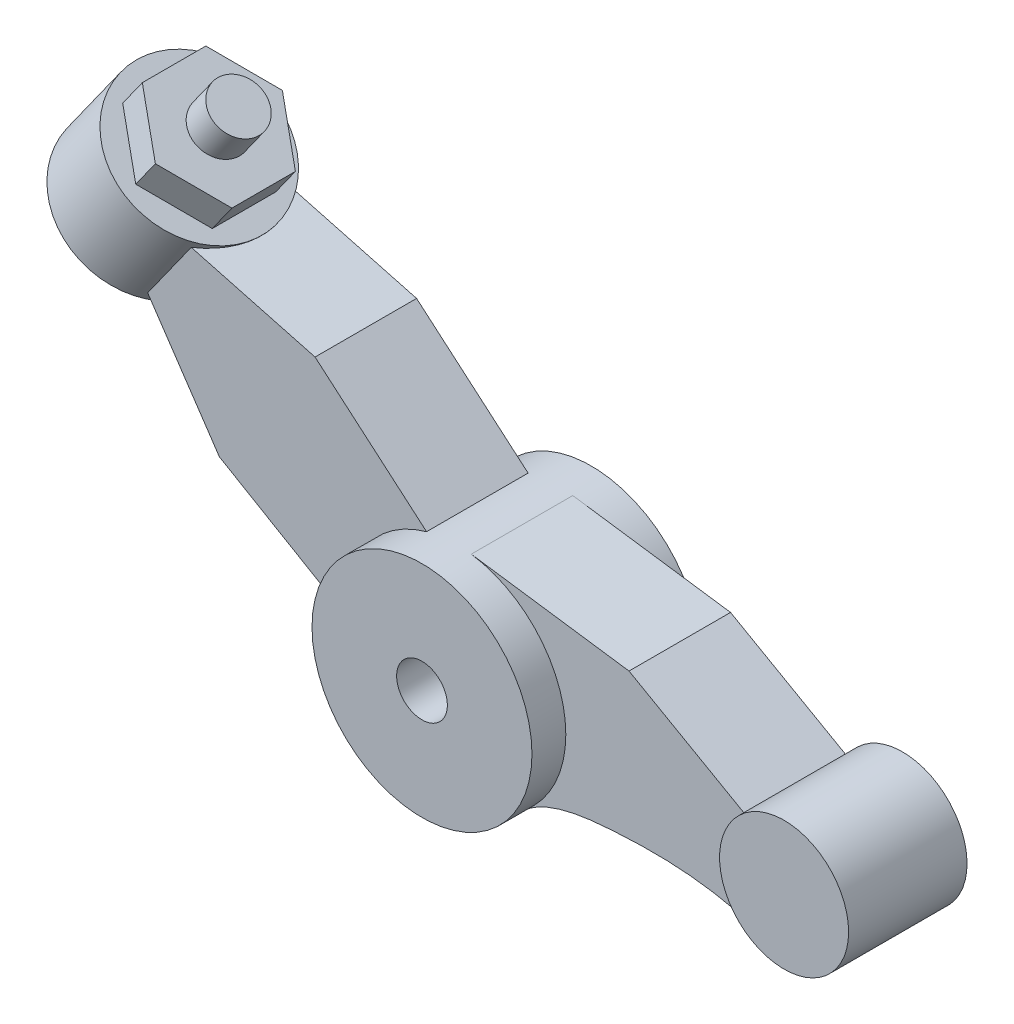
ISO-10303-21;
HEADER;
FILE_DESCRIPTION(('STEP AP214'),'2;1');
FILE_NAME('part.step','',(''),(''),'','','');
FILE_SCHEMA(('AUTOMOTIVE_DESIGN { 1 0 10303 214 1 1 1 1 }'));
ENDSEC;
DATA;
#1=APPLICATION_CONTEXT('core data for automotive mechanical design processes');
#2=APPLICATION_PROTOCOL_DEFINITION('international standard','automotive_design',2000,#1);
#3=PRODUCT_CONTEXT('',#1,'mechanical');
#4=PRODUCT('Part','Part','',(#3));
#5=PRODUCT_RELATED_PRODUCT_CATEGORY('part','',(#4));
#6=PRODUCT_DEFINITION_FORMATION('','',#4);
#7=PRODUCT_DEFINITION_CONTEXT('part definition',#1,'design');
#8=PRODUCT_DEFINITION('design','',#6,#7);
#9=PRODUCT_DEFINITION_SHAPE('','',#8);
#10=(LENGTH_UNIT() NAMED_UNIT(*) SI_UNIT(.MILLI.,.METRE.));
#11=(NAMED_UNIT(*) PLANE_ANGLE_UNIT() SI_UNIT($,.RADIAN.));
#12=(NAMED_UNIT(*) SI_UNIT($,.STERADIAN.) SOLID_ANGLE_UNIT());
#13=UNCERTAINTY_MEASURE_WITH_UNIT(LENGTH_MEASURE(1.E-05),#10,'distance_accuracy_value','');
#14=(GEOMETRIC_REPRESENTATION_CONTEXT(3) GLOBAL_UNCERTAINTY_ASSIGNED_CONTEXT((#13)) GLOBAL_UNIT_ASSIGNED_CONTEXT((#10,
#11,#12)) REPRESENTATION_CONTEXT('',''));
#15=CARTESIAN_POINT('',(0.,0.,0.));
#16=DIRECTION('',(0.,0.,1.));
#17=DIRECTION('',(1.,0.,0.));
#18=AXIS2_PLACEMENT_3D('',#15,#16,#17);
#19=CARTESIAN_POINT('',(0.,0.,25.4));
#20=DIRECTION('',(0.,0.,-1.));
#21=DIRECTION('',(-1.,0.,0.));
#22=AXIS2_PLACEMENT_3D('',#19,#20,#21);
#23=CYLINDRICAL_SURFACE('',#22,7.62);
#24=CARTESIAN_POINT('',(0.,0.,25.4));
#25=DIRECTION('',(0.,0.,1.));
#26=DIRECTION('',(1.,0.,0.));
#27=AXIS2_PLACEMENT_3D('',#24,#25,#26);
#28=CIRCLE('',#27,7.62);
#29=CARTESIAN_POINT('',(7.62,0.,25.4));
#30=VERTEX_POINT('',#29);
#31=EDGE_CURVE('E324',#30,#30,#28,.T.);
#32=ORIENTED_EDGE('',*,*,#31,.T.);
#33=EDGE_LOOP('',(#32));
#34=FACE_BOUND('',#33,.T.);
#35=CARTESIAN_POINT('',(0.,0.,-25.4));
#36=DIRECTION('',(0.,0.,1.));
#37=DIRECTION('',(1.,0.,0.));
#38=AXIS2_PLACEMENT_3D('',#35,#36,#37);
#39=CIRCLE('',#38,7.62);
#40=CARTESIAN_POINT('',(7.62,0.,-25.4));
#41=VERTEX_POINT('',#40);
#42=EDGE_CURVE('E325',#41,#41,#39,.T.);
#43=ORIENTED_EDGE('',*,*,#42,.F.);
#44=EDGE_LOOP('',(#43));
#45=FACE_BOUND('',#44,.T.);
#46=ADVANCED_FACE('F44',(#34,#45),#23,.F.);
#47=CARTESIAN_POINT('',(0.,0.,25.4));
#48=DIRECTION('',(0.,0.,-1.));
#49=DIRECTION('',(-1.,0.,0.));
#50=AXIS2_PLACEMENT_3D('',#47,#48,#49);
#51=CYLINDRICAL_SURFACE('',#50,33.02);
#52=DIRECTION('',(0.,0.,-1.));
#53=VECTOR('',#52,1.);
#54=CARTESIAN_POINT('',(-8.78149822097489,31.8308920546537,15.24));
#55=LINE('',#54,#53);
#56=CARTESIAN_POINT('',(-8.78149822097489,31.8308920546537,15.24));
#57=VERTEX_POINT('',#56);
#58=CARTESIAN_POINT('',(-8.78149822097489,31.8308920546537,-15.24));
#59=VERTEX_POINT('',#58);
#60=EDGE_CURVE('E262',#57,#59,#55,.T.);
#61=ORIENTED_EDGE('',*,*,#60,.F.);
#62=CARTESIAN_POINT('',(0.,0.,15.24));
#63=DIRECTION('',(0.,0.,1.));
#64=DIRECTION('',(1.,0.,0.));
#65=AXIS2_PLACEMENT_3D('',#62,#63,#64);
#66=CIRCLE('',#65,33.02);
#67=CARTESIAN_POINT('',(-32.9535005305209,-2.09456505866027,15.24));
#68=VERTEX_POINT('',#67);
#69=EDGE_CURVE('E217',#57,#68,#66,.T.);
#70=ORIENTED_EDGE('',*,*,#69,.T.);
#71=DIRECTION('',(0.,0.,-1.));
#72=VECTOR('',#71,1.);
#73=CARTESIAN_POINT('',(-32.9535005305209,-2.09456505866026,15.24));
#74=LINE('',#73,#72);
#75=CARTESIAN_POINT('',(-32.9535005305209,-2.09456505866026,-15.24));
#76=VERTEX_POINT('',#75);
#77=EDGE_CURVE('E235',#68,#76,#74,.T.);
#78=ORIENTED_EDGE('',*,*,#77,.T.);
#79=CARTESIAN_POINT('',(0.,0.,-15.24));
#80=DIRECTION('',(0.,0.,1.));
#81=DIRECTION('',(1.,0.,0.));
#82=AXIS2_PLACEMENT_3D('',#79,#80,#81);
#83=CIRCLE('',#82,33.02);
#84=EDGE_CURVE('E216',#59,#76,#83,.T.);
#85=ORIENTED_EDGE('',*,*,#84,.F.);
#86=EDGE_LOOP('',(#61,#70,#78,#85));
#87=FACE_BOUND('',#86,.T.);
#88=DIRECTION('',(0.,0.,-1.));
#89=VECTOR('',#88,1.);
#90=CARTESIAN_POINT('',(20.81989802796,-25.6291288596656,15.24));
#91=LINE('',#90,#89);
#92=CARTESIAN_POINT('',(20.81989802796,-25.6291288596656,15.24));
#93=VERTEX_POINT('',#92);
#94=CARTESIAN_POINT('',(20.81989802796,-25.6291288596656,-15.24));
#95=VERTEX_POINT('',#94);
#96=EDGE_CURVE('E314',#93,#95,#91,.T.);
#97=ORIENTED_EDGE('',*,*,#96,.F.);
#98=CARTESIAN_POINT('',(0.,0.,15.24));
#99=DIRECTION('',(0.,0.,1.));
#100=DIRECTION('',(1.,0.,0.));
#101=AXIS2_PLACEMENT_3D('',#98,#99,#100);
#102=CIRCLE('',#101,33.02);
#103=CARTESIAN_POINT('',(4.62675905087346,32.6942426229017,15.24));
#104=VERTEX_POINT('',#103);
#105=EDGE_CURVE('E358',#93,#104,#102,.T.);
#106=ORIENTED_EDGE('',*,*,#105,.T.);
#107=DIRECTION('',(0.,0.,-1.));
#108=VECTOR('',#107,1.);
#109=CARTESIAN_POINT('',(4.62675905087347,32.6942426229017,15.24));
#110=LINE('',#109,#108);
#111=CARTESIAN_POINT('',(4.62675905087347,32.6942426229017,-15.24));
#112=VERTEX_POINT('',#111);
#113=EDGE_CURVE('E353',#104,#112,#110,.T.);
#114=ORIENTED_EDGE('',*,*,#113,.T.);
#115=CARTESIAN_POINT('',(0.,0.,-15.24));
#116=DIRECTION('',(0.,0.,1.));
#117=DIRECTION('',(1.,0.,0.));
#118=AXIS2_PLACEMENT_3D('',#115,#116,#117);
#119=CIRCLE('',#118,33.02);
#120=EDGE_CURVE('E283',#95,#112,#119,.T.);
#121=ORIENTED_EDGE('',*,*,#120,.F.);
#122=EDGE_LOOP('',(#97,#106,#114,#121));
#123=FACE_BOUND('',#122,.T.);
#124=CARTESIAN_POINT('',(0.,0.,25.4));
#125=DIRECTION('',(0.,0.,1.));
#126=DIRECTION('',(1.,0.,0.));
#127=AXIS2_PLACEMENT_3D('',#124,#125,#126);
#128=CIRCLE('',#127,33.02);
#129=CARTESIAN_POINT('',(33.02,0.,25.4));
#130=VERTEX_POINT('',#129);
#131=EDGE_CURVE('E318',#130,#130,#128,.T.);
#132=ORIENTED_EDGE('',*,*,#131,.F.);
#133=EDGE_LOOP('',(#132));
#134=FACE_BOUND('',#133,.T.);
#135=CARTESIAN_POINT('',(0.,0.,-25.4));
#136=DIRECTION('',(0.,0.,1.));
#137=DIRECTION('',(1.,0.,0.));
#138=AXIS2_PLACEMENT_3D('',#135,#136,#137);
#139=CIRCLE('',#138,33.02);
#140=CARTESIAN_POINT('',(33.02,0.,-25.4));
#141=VERTEX_POINT('',#140);
#142=EDGE_CURVE('E321',#141,#141,#139,.T.);
#143=ORIENTED_EDGE('',*,*,#142,.T.);
#144=EDGE_LOOP('',(#143));
#145=FACE_BOUND('',#144,.T.);
#146=ADVANCED_FACE('F300',(#87,#123,#134,#145),#51,.T.);
#147=CARTESIAN_POINT('',(0.,0.,25.4));
#148=DIRECTION('',(0.,0.,1.));
#149=DIRECTION('',(1.,0.,0.));
#150=AXIS2_PLACEMENT_3D('',#147,#148,#149);
#151=PLANE('',#150);
#152=ORIENTED_EDGE('',*,*,#31,.F.);
#153=EDGE_LOOP('',(#152));
#154=FACE_BOUND('',#153,.T.);
#155=ORIENTED_EDGE('',*,*,#131,.T.);
#156=EDGE_LOOP('',(#155));
#157=FACE_BOUND('',#156,.T.);
#158=ADVANCED_FACE('F297',(#154,#157),#151,.T.);
#159=CARTESIAN_POINT('',(0.,0.,-25.4));
#160=DIRECTION('',(0.,0.,1.));
#161=DIRECTION('',(1.,0.,0.));
#162=AXIS2_PLACEMENT_3D('',#159,#160,#161);
#163=PLANE('',#162);
#164=ORIENTED_EDGE('',*,*,#42,.T.);
#165=EDGE_LOOP('',(#164));
#166=FACE_BOUND('',#165,.T.);
#167=ORIENTED_EDGE('',*,*,#142,.F.);
#168=EDGE_LOOP('',(#167));
#169=FACE_BOUND('',#168,.T.);
#170=ADVANCED_FACE('F294',(#166,#169),#163,.F.);
#171=CARTESIAN_POINT('',(89.3169550965066,-21.7241330754746,15.24));
#172=CARTESIAN_POINT('',(75.2764612033942,-17.4261699313366,15.24));
#173=CARTESIAN_POINT('',(52.8366105993641,-16.6710148810154,15.24));
#174=CARTESIAN_POINT('',(28.0082030744665,-19.7896881638226,15.24));
#175=CARTESIAN_POINT('',(20.81989802796,-25.6291288596656,15.24));
#176=B_SPLINE_CURVE_WITH_KNOTS('',3,(#171,#172,#173,#174,#175),.UNSPECIFIED.,.F.,.F.,(4,1,4),
(0.,0.609501507274578,1.),.UNSPECIFIED.);
#177=DIRECTION('',(0.,0.,-1.));
#178=VECTOR('',#177,1.);
#179=SURFACE_OF_LINEAR_EXTRUSION('',#176,#178);
#180=CARTESIAN_POINT('',(89.3169550965066,-21.7241330754746,-15.24));
#181=CARTESIAN_POINT('',(75.2764612033942,-17.4261699313366,-15.24));
#182=CARTESIAN_POINT('',(52.8366105993641,-16.6710148810154,-15.24));
#183=CARTESIAN_POINT('',(28.0082030744665,-19.7896881638226,-15.24));
#184=CARTESIAN_POINT('',(20.81989802796,-25.6291288596656,-15.24));
#185=B_SPLINE_CURVE_WITH_KNOTS('',3,(#180,#181,#182,#183,#184),.UNSPECIFIED.,.F.,.F.,(4,1,4),
(0.,0.609501507274578,1.),.UNSPECIFIED.);
#186=CARTESIAN_POINT('',(89.3169550965066,-21.7241330754746,-15.24));
#187=VERTEX_POINT('',#186);
#188=EDGE_CURVE('E271',#187,#95,#185,.T.);
#189=ORIENTED_EDGE('',*,*,#188,.F.);
#190=DIRECTION('',(0.,0.,-1.));
#191=VECTOR('',#190,1.);
#192=CARTESIAN_POINT('',(89.3169550965066,-21.7241330754746,15.24));
#193=LINE('',#192,#191);
#194=CARTESIAN_POINT('',(89.3169550965066,-21.7241330754746,15.24));
#195=VERTEX_POINT('',#194);
#196=EDGE_CURVE('E332',#195,#187,#193,.T.);
#197=ORIENTED_EDGE('',*,*,#196,.F.);
#198=EDGE_CURVE('E275',#195,#93,#176,.T.);
#199=ORIENTED_EDGE('',*,*,#198,.T.);
#200=ORIENTED_EDGE('',*,*,#96,.T.);
#201=EDGE_LOOP('',(#189,#197,#199,#200));
#202=FACE_BOUND('',#201,.T.);
#203=ADVANCED_FACE('F289',(#202),#179,.T.);
#204=CARTESIAN_POINT('',(23.8603711232424,41.9814773097678,15.24));
#205=DIRECTION('',(-0.494123043437464,-0.869391981757422,0.));
#206=DIRECTION('',(0.869391981757422,-0.494123043437464,0.));
#207=AXIS2_PLACEMENT_3D('',#204,#205,#206);
#208=PLANE('',#207);
#209=DIRECTION('',(-0.869391981757422,0.494123043437464,0.));
#210=VECTOR('',#209,1.);
#211=CARTESIAN_POINT('',(23.8603711232424,41.9814773097678,-15.24));
#212=LINE('',#211,#210);
#213=CARTESIAN_POINT('',(86.4956046015693,6.38244621430674,-15.24));
#214=VERTEX_POINT('',#213);
#215=CARTESIAN_POINT('',(51.9953519197285,25.9908279480012,-15.24));
#216=VERTEX_POINT('',#215);
#217=EDGE_CURVE('E366',#214,#216,#212,.T.);
#218=ORIENTED_EDGE('',*,*,#217,.T.);
#219=DIRECTION('',(0.,0.,-1.));
#220=VECTOR('',#219,1.);
#221=CARTESIAN_POINT('',(51.9953519197285,25.9908279480012,15.24));
#222=LINE('',#221,#220);
#223=CARTESIAN_POINT('',(51.9953519197285,25.9908279480012,15.24));
#224=VERTEX_POINT('',#223);
#225=EDGE_CURVE('E349',#224,#216,#222,.T.);
#226=ORIENTED_EDGE('',*,*,#225,.F.);
#227=DIRECTION('',(-0.869391981757422,0.494123043437464,0.));
#228=VECTOR('',#227,1.);
#229=CARTESIAN_POINT('',(23.8603711232424,41.9814773097678,15.24));
#230=LINE('',#229,#228);
#231=CARTESIAN_POINT('',(86.4956046015693,6.38244621430674,15.24));
#232=VERTEX_POINT('',#231);
#233=EDGE_CURVE('E386',#232,#224,#230,.T.);
#234=ORIENTED_EDGE('',*,*,#233,.F.);
#235=DIRECTION('',(0.,0.,-1.));
#236=VECTOR('',#235,1.);
#237=CARTESIAN_POINT('',(86.4956046015693,6.38244621430675,15.24));
#238=LINE('',#237,#236);
#239=EDGE_CURVE('E345',#232,#214,#238,.T.);
#240=ORIENTED_EDGE('',*,*,#239,.T.);
#241=EDGE_LOOP('',(#218,#226,#234,#240));
#242=FACE_BOUND('',#241,.T.);
#243=ADVANCED_FACE('F293',(#242),#208,.F.);
#244=CARTESIAN_POINT('',(4.62675905087346,32.6942426229017,15.24));
#245=DIRECTION('',(-0.140119898572788,-0.990134543394963,0.));
#246=DIRECTION('',(0.990134543394963,-0.140119898572788,0.));
#247=AXIS2_PLACEMENT_3D('',#244,#245,#246);
#248=PLANE('',#247);
#249=DIRECTION('',(-0.990134543394963,0.140119898572788,0.));
#250=VECTOR('',#249,1.);
#251=CARTESIAN_POINT('',(4.62675905087346,32.6942426229017,-15.24));
#252=LINE('',#251,#250);
#253=EDGE_CURVE('E362',#216,#112,#252,.T.);
#254=ORIENTED_EDGE('',*,*,#253,.T.);
#255=ORIENTED_EDGE('',*,*,#113,.F.);
#256=DIRECTION('',(-0.990134543394963,0.140119898572788,0.));
#257=VECTOR('',#256,1.);
#258=CARTESIAN_POINT('',(4.62675905087346,32.6942426229017,15.24));
#259=LINE('',#258,#257);
#260=EDGE_CURVE('E383',#224,#104,#259,.T.);
#261=ORIENTED_EDGE('',*,*,#260,.F.);
#262=ORIENTED_EDGE('',*,*,#225,.T.);
#263=EDGE_LOOP('',(#254,#255,#261,#262));
#264=FACE_BOUND('',#263,.T.);
#265=ADVANCED_FACE('F405',(#264),#248,.F.);
#266=CARTESIAN_POINT('',(0.,0.,15.24));
#267=DIRECTION('',(0.,0.,1.));
#268=DIRECTION('',(1.,0.,0.));
#269=AXIS2_PLACEMENT_3D('',#266,#267,#268);
#270=PLANE('',#269);
#271=ORIENTED_EDGE('',*,*,#198,.F.);
#272=CARTESIAN_POINT('',(101.092,-6.34725518135334,15.24));
#273=DIRECTION('',(0.,0.,1.));
#274=DIRECTION('',(1.,0.,0.));
#275=AXIS2_PLACEMENT_3D('',#272,#273,#274);
#276=CIRCLE('',#275,19.3675);
#277=EDGE_CURVE('E282',#232,#195,#276,.T.);
#278=ORIENTED_EDGE('',*,*,#277,.F.);
#279=ORIENTED_EDGE('',*,*,#233,.T.);
#280=ORIENTED_EDGE('',*,*,#260,.T.);
#281=ORIENTED_EDGE('',*,*,#105,.F.);
#282=EDGE_LOOP('',(#271,#278,#279,#280,#281));
#283=FACE_BOUND('',#282,.T.);
#284=ADVANCED_FACE('F400',(#283),#270,.T.);
#285=CARTESIAN_POINT('',(0.,0.,-15.24));
#286=DIRECTION('',(0.,0.,1.));
#287=DIRECTION('',(1.,0.,0.));
#288=AXIS2_PLACEMENT_3D('',#285,#286,#287);
#289=PLANE('',#288);
#290=ORIENTED_EDGE('',*,*,#188,.T.);
#291=ORIENTED_EDGE('',*,*,#120,.T.);
#292=ORIENTED_EDGE('',*,*,#253,.F.);
#293=ORIENTED_EDGE('',*,*,#217,.F.);
#294=CARTESIAN_POINT('',(101.092,-6.34725518135334,-15.24));
#295=DIRECTION('',(0.,0.,1.));
#296=DIRECTION('',(1.,0.,0.));
#297=AXIS2_PLACEMENT_3D('',#294,#295,#296);
#298=CIRCLE('',#297,19.3675);
#299=EDGE_CURVE('E369',#214,#187,#298,.T.);
#300=ORIENTED_EDGE('',*,*,#299,.T.);
#301=EDGE_LOOP('',(#290,#291,#292,#293,#300));
#302=FACE_BOUND('',#301,.T.);
#303=ADVANCED_FACE('F408',(#302),#289,.F.);
#304=CARTESIAN_POINT('',(101.092,-6.34725518135334,17.78));
#305=DIRECTION('',(0.,0.,-1.));
#306=DIRECTION('',(-1.,0.,0.));
#307=AXIS2_PLACEMENT_3D('',#304,#305,#306);
#308=CYLINDRICAL_SURFACE('',#307,19.3675);
#309=ORIENTED_EDGE('',*,*,#277,.T.);
#310=ORIENTED_EDGE('',*,*,#196,.T.);
#311=ORIENTED_EDGE('',*,*,#299,.F.);
#312=ORIENTED_EDGE('',*,*,#239,.F.);
#313=EDGE_LOOP('',(#309,#310,#311,#312));
#314=FACE_BOUND('',#313,.T.);
#315=CARTESIAN_POINT('',(101.092,-6.34725518135334,17.78));
#316=DIRECTION('',(0.,0.,1.));
#317=DIRECTION('',(1.,0.,0.));
#318=AXIS2_PLACEMENT_3D('',#315,#316,#317);
#319=CIRCLE('',#318,19.3675);
#320=CARTESIAN_POINT('',(120.4595,-6.34725518135334,17.78));
#321=VERTEX_POINT('',#320);
#322=EDGE_CURVE('E267',#321,#321,#319,.T.);
#323=ORIENTED_EDGE('',*,*,#322,.F.);
#324=EDGE_LOOP('',(#323));
#325=FACE_BOUND('',#324,.T.);
#326=CARTESIAN_POINT('',(101.092,-6.34725518135334,-17.78));
#327=DIRECTION('',(0.,0.,1.));
#328=DIRECTION('',(1.,0.,0.));
#329=AXIS2_PLACEMENT_3D('',#326,#327,#328);
#330=CIRCLE('',#329,19.3675);
#331=CARTESIAN_POINT('',(120.4595,-6.34725518135334,-17.78));
#332=VERTEX_POINT('',#331);
#333=EDGE_CURVE('E266',#332,#332,#330,.T.);
#334=ORIENTED_EDGE('',*,*,#333,.T.);
#335=EDGE_LOOP('',(#334));
#336=FACE_BOUND('',#335,.T.);
#337=ADVANCED_FACE('F395',(#314,#325,#336),#308,.T.);
#338=CARTESIAN_POINT('',(0.,0.,17.78));
#339=DIRECTION('',(0.,0.,1.));
#340=DIRECTION('',(1.,0.,0.));
#341=AXIS2_PLACEMENT_3D('',#338,#339,#340);
#342=PLANE('',#341);
#343=ORIENTED_EDGE('',*,*,#322,.T.);
#344=EDGE_LOOP('',(#343));
#345=FACE_BOUND('',#344,.T.);
#346=ADVANCED_FACE('F423',(#345),#342,.T.);
#347=CARTESIAN_POINT('',(0.,0.,-17.78));
#348=DIRECTION('',(0.,0.,1.));
#349=DIRECTION('',(1.,0.,0.));
#350=AXIS2_PLACEMENT_3D('',#347,#348,#349);
#351=PLANE('',#350);
#352=ORIENTED_EDGE('',*,*,#333,.F.);
#353=EDGE_LOOP('',(#352));
#354=FACE_BOUND('',#353,.T.);
#355=ADVANCED_FACE('F424',(#354),#351,.F.);
#356=CARTESIAN_POINT('',(12.0107387373685,14.0256586380597,15.24));
#357=DIRECTION('',(0.650439956768788,0.759557675649859,0.));
#358=DIRECTION('',(-0.759557675649859,0.650439956768788,0.));
#359=AXIS2_PLACEMENT_3D('',#356,#357,#358);
#360=PLANE('',#359);
#361=DIRECTION('',(0.759557675649859,-0.650439956768788,0.));
#362=VECTOR('',#361,1.);
#363=CARTESIAN_POINT('',(12.0107387373685,14.0256586380597,-15.24));
#364=LINE('',#363,#362);
#365=CARTESIAN_POINT('',(-42.2626039786908,60.5021170053958,-15.24));
#366=VERTEX_POINT('',#365);
#367=EDGE_CURVE('E239',#366,#59,#364,.T.);
#368=ORIENTED_EDGE('',*,*,#367,.F.);
#369=DIRECTION('',(0.,0.,-1.));
#370=VECTOR('',#369,1.);
#371=CARTESIAN_POINT('',(-42.2626039786908,60.5021170053958,15.24));
#372=LINE('',#371,#370);
#373=CARTESIAN_POINT('',(-42.2626039786908,60.5021170053958,15.24));
#374=VERTEX_POINT('',#373);
#375=EDGE_CURVE('E258',#374,#366,#372,.T.);
#376=ORIENTED_EDGE('',*,*,#375,.F.);
#377=DIRECTION('',(0.759557675649859,-0.650439956768788,0.));
#378=VECTOR('',#377,1.);
#379=CARTESIAN_POINT('',(12.0107387373685,14.0256586380597,15.24));
#380=LINE('',#379,#378);
#381=EDGE_CURVE('E220',#374,#57,#380,.T.);
#382=ORIENTED_EDGE('',*,*,#381,.T.);
#383=ORIENTED_EDGE('',*,*,#60,.T.);
#384=EDGE_LOOP('',(#368,#376,#382,#383));
#385=FACE_BOUND('',#384,.T.);
#386=ADVANCED_FACE('F427',(#385),#360,.T.);
#387=CARTESIAN_POINT('',(12.2732307480519,45.9289300704433,15.24));
#388=DIRECTION('',(0.258163705548555,0.966101185765466,0.));
#389=DIRECTION('',(-0.966101185765466,0.258163705548555,0.));
#390=AXIS2_PLACEMENT_3D('',#387,#388,#389);
#391=PLANE('',#390);
#392=CARTESIAN_POINT('',(-97.3523684192409,75.2233262693105,0.));
#393=DIRECTION('',(0.258163705548555,0.966101185765466,0.));
#394=DIRECTION('',(0.966101185765466,-0.258163705548555,0.));
#395=AXIS2_PLACEMENT_3D('',#392,#393,#394);
#396=ELLIPSE('',#395,24.6781514079764,23.1140000000006);
#397=CARTESIAN_POINT('',(-79.4272031793529,70.4333237839776,15.24));
#398=VERTEX_POINT('',#397);
#399=CARTESIAN_POINT('',(-79.4272031793529,70.4333237839775,-15.24));
#400=VERTEX_POINT('',#399);
#401=EDGE_CURVE('E210',#398,#400,#396,.T.);
#402=ORIENTED_EDGE('',*,*,#401,.F.);
#403=DIRECTION('',(0.966101185765466,-0.258163705548556,0.));
#404=VECTOR('',#403,1.);
#405=CARTESIAN_POINT('',(12.2732307480519,45.9289300704433,15.24));
#406=LINE('',#405,#404);
#407=EDGE_CURVE('E225',#398,#374,#406,.T.);
#408=ORIENTED_EDGE('',*,*,#407,.T.);
#409=ORIENTED_EDGE('',*,*,#375,.T.);
#410=DIRECTION('',(0.966101185765466,-0.258163705548556,0.));
#411=VECTOR('',#410,1.);
#412=CARTESIAN_POINT('',(12.2732307480519,45.9289300704433,-15.24));
#413=LINE('',#412,#411);
#414=EDGE_CURVE('E243',#400,#366,#413,.T.);
#415=ORIENTED_EDGE('',*,*,#414,.F.);
#416=EDGE_LOOP('',(#402,#408,#409,#415));
#417=FACE_BOUND('',#416,.T.);
#418=ADVANCED_FACE('F434',(#417),#391,.T.);
#419=CARTESIAN_POINT('',(-39.403050823148,-26.5988420093621,15.24));
#420=DIRECTION('',(0.828831284870661,0.559498615922907,0.));
#421=DIRECTION('',(-0.559498615922907,0.828831284870661,0.));
#422=AXIS2_PLACEMENT_3D('',#419,#420,#421);
#423=PLANE('',#422);
#424=DIRECTION('',(0.559498615922907,-0.828831284870661,0.));
#425=VECTOR('',#424,1.);
#426=CARTESIAN_POINT('',(-39.403050823148,-26.5988420093621,15.24));
#427=LINE('',#426,#425);
#428=CARTESIAN_POINT('',(-92.509564527778,52.0722015573924,15.24));
#429=VERTEX_POINT('',#428);
#430=CARTESIAN_POINT('',(-70.9864134122716,20.1881888255564,15.24));
#431=VERTEX_POINT('',#430);
#432=EDGE_CURVE('E228',#429,#431,#427,.T.);
#433=ORIENTED_EDGE('',*,*,#432,.F.);
#434=CARTESIAN_POINT('',(-102.890573566661,67.4504434602049,0.));
#435=DIRECTION('',(0.828831284870661,0.559498615922907,0.));
#436=DIRECTION('',(-0.559498615922907,0.828831284870661,0.));
#437=AXIS2_PLACEMENT_3D('',#434,#435,#436);
#438=ELLIPSE('',#437,24.6781514079764,23.1140000000006);
#439=CARTESIAN_POINT('',(-92.509564527778,52.0722015573924,-15.24));
#440=VERTEX_POINT('',#439);
#441=EDGE_CURVE('E206',#429,#440,#438,.T.);
#442=ORIENTED_EDGE('',*,*,#441,.T.);
#443=DIRECTION('',(0.559498615922907,-0.828831284870661,0.));
#444=VECTOR('',#443,1.);
#445=CARTESIAN_POINT('',(-39.403050823148,-26.5988420093621,-15.24));
#446=LINE('',#445,#444);
#447=CARTESIAN_POINT('',(-70.9864134122716,20.1881888255564,-15.24));
#448=VERTEX_POINT('',#447);
#449=EDGE_CURVE('E246',#440,#448,#446,.T.);
#450=ORIENTED_EDGE('',*,*,#449,.T.);
#451=DIRECTION('',(0.,0.,-1.));
#452=VECTOR('',#451,1.);
#453=CARTESIAN_POINT('',(-70.9864134122716,20.1881888255564,15.24));
#454=LINE('',#453,#452);
#455=EDGE_CURVE('E254',#431,#448,#454,.T.);
#456=ORIENTED_EDGE('',*,*,#455,.F.);
#457=EDGE_LOOP('',(#433,#442,#450,#456));
#458=FACE_BOUND('',#457,.T.);
#459=ADVANCED_FACE('F438',(#458),#423,.F.);
#460=CARTESIAN_POINT('',(-9.33452741249141,-15.9324682091053,15.24));
#461=DIRECTION('',(0.505510088879697,0.862820694026772,0.));
#462=DIRECTION('',(-0.862820694026772,0.505510088879697,0.));
#463=AXIS2_PLACEMENT_3D('',#460,#461,#462);
#464=PLANE('',#463);
#465=DIRECTION('',(0.862820694026772,-0.505510088879697,0.));
#466=VECTOR('',#465,1.);
#467=CARTESIAN_POINT('',(-9.33452741249141,-15.9324682091053,-15.24));
#468=LINE('',#467,#466);
#469=EDGE_CURVE('E221',#448,#76,#468,.T.);
#470=ORIENTED_EDGE('',*,*,#469,.T.);
#471=ORIENTED_EDGE('',*,*,#77,.F.);
#472=DIRECTION('',(0.862820694026772,-0.505510088879697,0.));
#473=VECTOR('',#472,1.);
#474=CARTESIAN_POINT('',(-9.33452741249141,-15.9324682091053,15.24));
#475=LINE('',#474,#473);
#476=EDGE_CURVE('E231',#431,#68,#475,.T.);
#477=ORIENTED_EDGE('',*,*,#476,.F.);
#478=ORIENTED_EDGE('',*,*,#455,.T.);
#479=EDGE_LOOP('',(#470,#471,#477,#478));
#480=FACE_BOUND('',#479,.T.);
#481=ADVANCED_FACE('F442',(#480),#464,.F.);
#482=CARTESIAN_POINT('',(0.,0.,15.24));
#483=DIRECTION('',(0.,0.,1.));
#484=DIRECTION('',(1.,0.,0.));
#485=AXIS2_PLACEMENT_3D('',#482,#483,#484);
#486=PLANE('',#485);
#487=DIRECTION('',(0.580276606240301,0.814419462101833,0.));
#488=VECTOR('',#487,1.);
#489=CARTESIAN_POINT('',(-80.3307064856378,69.1652549547354,15.24));
#490=LINE('',#489,#488);
#491=EDGE_CURVE('E213',#429,#398,#490,.T.);
#492=ORIENTED_EDGE('',*,*,#491,.F.);
#493=ORIENTED_EDGE('',*,*,#432,.T.);
#494=ORIENTED_EDGE('',*,*,#476,.T.);
#495=ORIENTED_EDGE('',*,*,#69,.F.);
#496=ORIENTED_EDGE('',*,*,#381,.F.);
#497=ORIENTED_EDGE('',*,*,#407,.F.);
#498=EDGE_LOOP('',(#492,#493,#494,#495,#496,#497));
#499=FACE_BOUND('',#498,.T.);
#500=ADVANCED_FACE('F446',(#499),#486,.T.);
#501=CARTESIAN_POINT('',(0.,0.,-15.24));
#502=DIRECTION('',(0.,0.,1.));
#503=DIRECTION('',(1.,0.,0.));
#504=AXIS2_PLACEMENT_3D('',#501,#502,#503);
#505=PLANE('',#504);
#506=ORIENTED_EDGE('',*,*,#449,.F.);
#507=DIRECTION('',(0.580276606240301,0.814419462101833,0.));
#508=VECTOR('',#507,1.);
#509=CARTESIAN_POINT('',(-80.3307064856378,69.1652549547354,-15.24));
#510=LINE('',#509,#508);
#511=EDGE_CURVE('E53',#440,#400,#510,.T.);
#512=ORIENTED_EDGE('',*,*,#511,.T.);
#513=ORIENTED_EDGE('',*,*,#414,.T.);
#514=ORIENTED_EDGE('',*,*,#367,.T.);
#515=ORIENTED_EDGE('',*,*,#84,.T.);
#516=ORIENTED_EDGE('',*,*,#469,.F.);
#517=EDGE_LOOP('',(#506,#512,#513,#514,#515,#516));
#518=FACE_BOUND('',#517,.T.);
#519=ADVANCED_FACE('F448',(#518),#505,.F.);
#520=CARTESIAN_POINT('',(-127.017892365068,73.4204273695815,0.));
#521=DIRECTION('',(-0.580276606240301,-0.814419462101833,0.));
#522=DIRECTION('',(0.814419462101833,-0.580276606240301,0.));
#523=AXIS2_PLACEMENT_3D('',#520,#521,#522);
#524=PLANE('',#523);
#525=CARTESIAN_POINT('',(-108.193400918046,60.0079138929429,0.));
#526=DIRECTION('',(-0.580276606240301,-0.814419462101833,0.));
#527=DIRECTION('',(0.814419462101833,-0.580276606240301,0.));
#528=AXIS2_PLACEMENT_3D('',#525,#526,#527);
#529=CIRCLE('',#528,7.97356922232805);
#530=CARTESIAN_POINT('',(-101.699570960966,55.3810382049882,0.));
#531=VERTEX_POINT('',#530);
#532=EDGE_CURVE('E47',#531,#531,#529,.F.);
#533=ORIENTED_EDGE('',*,*,#532,.T.);
#534=EDGE_LOOP('',(#533));
#535=FACE_BOUND('',#534,.T.);
#536=CARTESIAN_POINT('',(-108.193400918046,60.0079138929428,0.));
#537=DIRECTION('',(0.580276606240301,0.814419462101833,0.));
#538=DIRECTION('',(-0.814419462101833,0.580276606240301,0.));
#539=AXIS2_PLACEMENT_3D('',#536,#537,#538);
#540=CIRCLE('',#539,23.1140000000006);
#541=CARTESIAN_POINT('',(-127.017892365068,73.4204273695815,0.));
#542=VERTEX_POINT('',#541);
#543=EDGE_CURVE('E198',#542,#542,#540,.T.);
#544=ORIENTED_EDGE('',*,*,#543,.F.);
#545=EDGE_LOOP('',(#544));
#546=FACE_BOUND('',#545,.T.);
#547=ADVANCED_FACE('F451',(#535,#546),#524,.T.);
#548=CARTESIAN_POINT('',(-92.275253055662,82.3490685773204,0.));
#549=DIRECTION('',(0.580276606240301,0.814419462101833,0.));
#550=DIRECTION('',(-0.814419462101833,0.580276606240301,0.));
#551=AXIS2_PLACEMENT_3D('',#548,#549,#550);
#552=PLANE('',#551);
#553=DIRECTION('',(0.705307943516645,-0.50253428222592,-0.500000000000001));
#554=VECTOR('',#553,1.);
#555=CARTESIAN_POINT('',(-92.2752530556619,82.3490685773204,19.0641058886414));
#556=LINE('',#555,#554);
#557=CARTESIAN_POINT('',(-92.2752530556619,82.3490685773204,19.0641058886414));
#558=VERTEX_POINT('',#557);
#559=CARTESIAN_POINT('',(-78.8291877363607,72.768701808293,9.53205294432073));
#560=VERTEX_POINT('',#559);
#561=EDGE_CURVE('E61',#558,#560,#556,.T.);
#562=ORIENTED_EDGE('',*,*,#561,.F.);
#563=DIRECTION('',(0.705307943516645,-0.50253428222592,0.500000000000001));
#564=VECTOR('',#563,1.);
#565=CARTESIAN_POINT('',(-105.721318374963,91.9294353463478,9.5320529443207));
#566=LINE('',#565,#564);
#567=CARTESIAN_POINT('',(-105.721318374963,91.9294353463478,9.5320529443207));
#568=VERTEX_POINT('',#567);
#569=EDGE_CURVE('E65',#568,#558,#566,.T.);
#570=ORIENTED_EDGE('',*,*,#569,.F.);
#571=DIRECTION('',(0.,0.,1.));
#572=VECTOR('',#571,1.);
#573=CARTESIAN_POINT('',(-105.721318374963,91.9294353463478,-9.53205294432071));
#574=LINE('',#573,#572);
#575=CARTESIAN_POINT('',(-105.721318374963,91.9294353463478,-9.53205294432071));
#576=VERTEX_POINT('',#575);
#577=EDGE_CURVE('E535',#576,#568,#574,.T.);
#578=ORIENTED_EDGE('',*,*,#577,.F.);
#579=DIRECTION('',(-0.705307943516646,0.502534282225919,0.5));
#580=VECTOR('',#579,1.);
#581=CARTESIAN_POINT('',(-92.2752530556619,82.3490685773204,-19.0641058886414));
#582=LINE('',#581,#580);
#583=CARTESIAN_POINT('',(-92.2752530556619,82.3490685773204,-19.0641058886414));
#584=VERTEX_POINT('',#583);
#585=EDGE_CURVE('E531',#584,#576,#582,.T.);
#586=ORIENTED_EDGE('',*,*,#585,.F.);
#587=DIRECTION('',(-0.705307943516645,0.502534282225921,-0.5));
#588=VECTOR('',#587,1.);
#589=CARTESIAN_POINT('',(-78.8291877363606,72.768701808293,-9.53205294432072));
#590=LINE('',#589,#588);
#591=CARTESIAN_POINT('',(-78.8291877363606,72.768701808293,-9.53205294432072));
#592=VERTEX_POINT('',#591);
#593=EDGE_CURVE('E527',#592,#584,#590,.T.);
#594=ORIENTED_EDGE('',*,*,#593,.F.);
#595=DIRECTION('',(0.,0.,-1.));
#596=VECTOR('',#595,1.);
#597=CARTESIAN_POINT('',(-78.8291877363607,72.768701808293,9.53205294432073));
#598=LINE('',#597,#596);
#599=EDGE_CURVE('E511',#560,#592,#598,.T.);
#600=ORIENTED_EDGE('',*,*,#599,.F.);
#601=EDGE_LOOP('',(#562,#570,#578,#586,#594,#600));
#602=FACE_BOUND('',#601,.T.);
#603=CARTESIAN_POINT('',(-92.275253055662,82.3490685773204,0.));
#604=DIRECTION('',(0.580276606240301,0.814419462101833,0.));
#605=DIRECTION('',(-0.814419462101833,0.580276606240301,0.));
#606=AXIS2_PLACEMENT_3D('',#603,#604,#605);
#607=CIRCLE('',#606,23.1140000000006);
#608=CARTESIAN_POINT('',(-111.099744502684,95.761582053959,0.));
#609=VERTEX_POINT('',#608);
#610=EDGE_CURVE('E202',#609,#609,#607,.T.);
#611=ORIENTED_EDGE('',*,*,#610,.T.);
#612=EDGE_LOOP('',(#611));
#613=FACE_BOUND('',#612,.T.);
#614=ADVANCED_FACE('F457',(#602,#613),#552,.T.);
#615=CARTESIAN_POINT('',(-94.4837936250233,79.249377148808,0.));
#616=DIRECTION('',(0.580276606240301,0.814419462101833,0.));
#617=DIRECTION('',(-0.814419462101833,0.580276606240301,0.));
#618=AXIS2_PLACEMENT_3D('',#615,#616,#617);
#619=CYLINDRICAL_SURFACE('',#618,23.1140000000006);
#620=ORIENTED_EDGE('',*,*,#441,.F.);
#621=ORIENTED_EDGE('',*,*,#491,.T.);
#622=ORIENTED_EDGE('',*,*,#401,.T.);
#623=ORIENTED_EDGE('',*,*,#511,.F.);
#624=EDGE_LOOP('',(#620,#621,#622,#623));
#625=FACE_BOUND('',#624,.T.);
#626=ORIENTED_EDGE('',*,*,#543,.T.);
#627=EDGE_LOOP('',(#626));
#628=FACE_BOUND('',#627,.T.);
#629=ORIENTED_EDGE('',*,*,#610,.F.);
#630=EDGE_LOOP('',(#629));
#631=FACE_BOUND('',#630,.T.);
#632=ADVANCED_FACE('F461',(#625,#628,#631),#619,.T.);
#633=CARTESIAN_POINT('',(-113.019395003571,53.2346208375745,0.));
#634=DIRECTION('',(0.580276606240301,0.814419462101833,0.));
#635=DIRECTION('',(-0.814419462101833,0.580276606240301,0.));
#636=AXIS2_PLACEMENT_3D('',#633,#634,#635);
#637=CONICAL_SURFACE('',#636,4.56705677579405,0.388753380986943);
#638=ORIENTED_EDGE('',*,*,#532,.F.);
#639=EDGE_LOOP('',(#638));
#640=FACE_BOUND('',#639,.T.);
#641=CARTESIAN_POINT('',(-113.019395003571,53.2346208375745,0.));
#642=DIRECTION('',(0.580276606240301,0.814419462101833,0.));
#643=DIRECTION('',(-0.814419462101833,0.580276606240301,0.));
#644=AXIS2_PLACEMENT_3D('',#641,#642,#643);
#645=CIRCLE('',#644,4.56705677579405);
#646=CARTESIAN_POINT('',(-116.738894926302,55.884777043939,0.));
#647=VERTEX_POINT('',#646);
#648=EDGE_CURVE('E188',#647,#647,#645,.T.);
#649=ORIENTED_EDGE('',*,*,#648,.T.);
#650=EDGE_LOOP('',(#649));
#651=FACE_BOUND('',#650,.T.);
#652=ADVANCED_FACE('F464',(#640,#651),#637,.T.);
#653=CARTESIAN_POINT('',(-117.445277408727,47.0228853842242,0.));
#654=DIRECTION('',(0.580276606240301,0.814419462101833,0.));
#655=DIRECTION('',(-0.814419462101833,0.580276606240301,0.));
#656=AXIS2_PLACEMENT_3D('',#653,#654,#655);
#657=SPHERICAL_SURFACE('',#656,8.89);
#658=ORIENTED_EDGE('',*,*,#648,.F.);
#659=EDGE_LOOP('',(#658));
#660=FACE_BOUND('',#659,.T.);
#661=ADVANCED_FACE('F468',(#660),#657,.T.);
#662=CARTESIAN_POINT('',(-86.3796427362604,90.623570312275,19.0641058886414));
#663=DIRECTION('',(-0.407209731050917,0.290138303120151,-0.866025403784438));
#664=DIRECTION('',(-0.90495216966695,0.,0.425513302512483));
#665=AXIS2_PLACEMENT_3D('',#662,#663,#664);
#666=PLANE('',#665);
#667=ORIENTED_EDGE('',*,*,#561,.T.);
#668=DIRECTION('',(-0.580276606240301,-0.814419462101833,0.));
#669=VECTOR('',#668,1.);
#670=CARTESIAN_POINT('',(-72.9335774169592,81.0432035432477,9.53205294432073));
#671=LINE('',#670,#669);
#672=CARTESIAN_POINT('',(-72.9335774169592,81.0432035432477,9.53205294432073));
#673=VERTEX_POINT('',#672);
#674=EDGE_CURVE('E168',#673,#560,#671,.T.);
#675=ORIENTED_EDGE('',*,*,#674,.F.);
#676=DIRECTION('',(0.705307943516645,-0.50253428222592,-0.500000000000001));
#677=VECTOR('',#676,1.);
#678=CARTESIAN_POINT('',(-86.3796427362604,90.623570312275,19.0641058886414));
#679=LINE('',#678,#677);
#680=CARTESIAN_POINT('',(-86.3796427362604,90.623570312275,19.0641058886414));
#681=VERTEX_POINT('',#680);
#682=EDGE_CURVE('E175',#681,#673,#679,.T.);
#683=ORIENTED_EDGE('',*,*,#682,.F.);
#684=DIRECTION('',(-0.580276606240301,-0.814419462101833,0.));
#685=VECTOR('',#684,1.);
#686=CARTESIAN_POINT('',(-86.3796427362604,90.623570312275,19.0641058886414));
#687=LINE('',#686,#685);
#688=EDGE_CURVE('E523',#681,#558,#687,.T.);
#689=ORIENTED_EDGE('',*,*,#688,.T.);
#690=EDGE_LOOP('',(#667,#675,#683,#689));
#691=FACE_BOUND('',#690,.T.);
#692=ADVANCED_FACE('F186',(#691),#666,.F.);
#693=CARTESIAN_POINT('',(-72.9335774169592,81.0432035432477,9.53205294432073));
#694=DIRECTION('',(-0.814419462101833,0.580276606240301,0.));
#695=DIRECTION('',(-0.580276606240301,-0.814419462101833,0.));
#696=AXIS2_PLACEMENT_3D('',#693,#694,#695);
#697=PLANE('',#696);
#698=ORIENTED_EDGE('',*,*,#599,.T.);
#699=DIRECTION('',(-0.580276606240301,-0.814419462101833,0.));
#700=VECTOR('',#699,1.);
#701=CARTESIAN_POINT('',(-72.9335774169592,81.0432035432477,-9.53205294432072));
#702=LINE('',#701,#700);
#703=CARTESIAN_POINT('',(-72.9335774169592,81.0432035432477,-9.53205294432072));
#704=VERTEX_POINT('',#703);
#705=EDGE_CURVE('E170',#704,#592,#702,.T.);
#706=ORIENTED_EDGE('',*,*,#705,.F.);
#707=DIRECTION('',(0.,0.,-1.));
#708=VECTOR('',#707,1.);
#709=CARTESIAN_POINT('',(-72.9335774169592,81.0432035432477,9.53205294432073));
#710=LINE('',#709,#708);
#711=EDGE_CURVE('E163',#673,#704,#710,.T.);
#712=ORIENTED_EDGE('',*,*,#711,.F.);
#713=ORIENTED_EDGE('',*,*,#674,.T.);
#714=EDGE_LOOP('',(#698,#706,#712,#713));
#715=FACE_BOUND('',#714,.T.);
#716=ADVANCED_FACE('F166',(#715),#697,.F.);
#717=CARTESIAN_POINT('',(-72.9335774169592,81.0432035432477,-9.53205294432072));
#718=DIRECTION('',(-0.407209731050916,0.29013830312015,0.866025403784439));
#719=DIRECTION('',(0.90495216966695,0.,0.425513302512482));
#720=AXIS2_PLACEMENT_3D('',#717,#718,#719);
#721=PLANE('',#720);
#722=ORIENTED_EDGE('',*,*,#593,.T.);
#723=DIRECTION('',(-0.580276606240301,-0.814419462101833,0.));
#724=VECTOR('',#723,1.);
#725=CARTESIAN_POINT('',(-86.3796427362604,90.623570312275,-19.0641058886414));
#726=LINE('',#725,#724);
#727=CARTESIAN_POINT('',(-86.3796427362604,90.623570312275,-19.0641058886414));
#728=VERTEX_POINT('',#727);
#729=EDGE_CURVE('E194',#728,#584,#726,.T.);
#730=ORIENTED_EDGE('',*,*,#729,.F.);
#731=DIRECTION('',(-0.705307943516645,0.502534282225921,-0.5));
#732=VECTOR('',#731,1.);
#733=CARTESIAN_POINT('',(-72.9335774169592,81.0432035432477,-9.53205294432072));
#734=LINE('',#733,#732);
#735=EDGE_CURVE('E174',#704,#728,#734,.T.);
#736=ORIENTED_EDGE('',*,*,#735,.F.);
#737=ORIENTED_EDGE('',*,*,#705,.T.);
#738=EDGE_LOOP('',(#722,#730,#736,#737));
#739=FACE_BOUND('',#738,.T.);
#740=ADVANCED_FACE('F477',(#739),#721,.F.);
#741=CARTESIAN_POINT('',(-86.3796427362604,90.623570312275,-19.0641058886414));
#742=DIRECTION('',(0.407209731050917,-0.29013830312015,0.866025403784439));
#743=DIRECTION('',(0.90495216966695,0.,-0.425513302512482));
#744=AXIS2_PLACEMENT_3D('',#741,#742,#743);
#745=PLANE('',#744);
#746=ORIENTED_EDGE('',*,*,#585,.T.);
#747=DIRECTION('',(-0.580276606240301,-0.814419462101833,0.));
#748=VECTOR('',#747,1.);
#749=CARTESIAN_POINT('',(-99.8257080555617,100.203937081302,-9.53205294432071));
#750=LINE('',#749,#748);
#751=CARTESIAN_POINT('',(-99.8257080555617,100.203937081302,-9.53205294432071));
#752=VERTEX_POINT('',#751);
#753=EDGE_CURVE('E546',#752,#576,#750,.T.);
#754=ORIENTED_EDGE('',*,*,#753,.F.);
#755=DIRECTION('',(-0.705307943516646,0.502534282225919,0.5));
#756=VECTOR('',#755,1.);
#757=CARTESIAN_POINT('',(-86.3796427362604,90.623570312275,-19.0641058886414));
#758=LINE('',#757,#756);
#759=EDGE_CURVE('E516',#728,#752,#758,.T.);
#760=ORIENTED_EDGE('',*,*,#759,.F.);
#761=ORIENTED_EDGE('',*,*,#729,.T.);
#762=EDGE_LOOP('',(#746,#754,#760,#761));
#763=FACE_BOUND('',#762,.T.);
#764=ADVANCED_FACE('F480',(#763),#745,.F.);
#765=CARTESIAN_POINT('',(-99.8257080555617,100.203937081302,-9.53205294432071));
#766=DIRECTION('',(0.814419462101833,-0.580276606240301,0.));
#767=DIRECTION('',(0.580276606240301,0.814419462101833,0.));
#768=AXIS2_PLACEMENT_3D('',#765,#766,#767);
#769=PLANE('',#768);
#770=ORIENTED_EDGE('',*,*,#577,.T.);
#771=DIRECTION('',(-0.580276606240301,-0.814419462101833,0.));
#772=VECTOR('',#771,1.);
#773=CARTESIAN_POINT('',(-99.8257080555617,100.203937081302,9.5320529443207));
#774=LINE('',#773,#772);
#775=CARTESIAN_POINT('',(-99.8257080555617,100.203937081302,9.5320529443207));
#776=VERTEX_POINT('',#775);
#777=EDGE_CURVE('E542',#776,#568,#774,.T.);
#778=ORIENTED_EDGE('',*,*,#777,.F.);
#779=DIRECTION('',(0.,0.,1.));
#780=VECTOR('',#779,1.);
#781=CARTESIAN_POINT('',(-99.8257080555617,100.203937081302,-9.53205294432071));
#782=LINE('',#781,#780);
#783=EDGE_CURVE('E519',#752,#776,#782,.T.);
#784=ORIENTED_EDGE('',*,*,#783,.F.);
#785=ORIENTED_EDGE('',*,*,#753,.T.);
#786=EDGE_LOOP('',(#770,#778,#784,#785));
#787=FACE_BOUND('',#786,.T.);
#788=ADVANCED_FACE('F484',(#787),#769,.F.);
#789=CARTESIAN_POINT('',(-99.8257080555617,100.203937081302,9.5320529443207));
#790=DIRECTION('',(0.407209731050917,-0.290138303120151,-0.866025403784438));
#791=DIRECTION('',(-0.90495216966695,0.,-0.425513302512483));
#792=AXIS2_PLACEMENT_3D('',#789,#790,#791);
#793=PLANE('',#792);
#794=ORIENTED_EDGE('',*,*,#569,.T.);
#795=ORIENTED_EDGE('',*,*,#688,.F.);
#796=DIRECTION('',(0.705307943516645,-0.50253428222592,0.500000000000001));
#797=VECTOR('',#796,1.);
#798=CARTESIAN_POINT('',(-99.8257080555617,100.203937081302,9.5320529443207));
#799=LINE('',#798,#797);
#800=EDGE_CURVE('E180',#776,#681,#799,.T.);
#801=ORIENTED_EDGE('',*,*,#800,.F.);
#802=ORIENTED_EDGE('',*,*,#777,.T.);
#803=EDGE_LOOP('',(#794,#795,#801,#802));
#804=FACE_BOUND('',#803,.T.);
#805=ADVANCED_FACE('F488',(#804),#793,.F.);
#806=CARTESIAN_POINT('',(13.7418282566905,19.2866854475175,0.));
#807=DIRECTION('',(0.580276606240301,0.814419462101833,0.));
#808=DIRECTION('',(-0.814419462101833,0.580276606240301,0.));
#809=AXIS2_PLACEMENT_3D('',#806,#807,#808);
#810=PLANE('',#809);
#811=CARTESIAN_POINT('',(-86.3796427362605,90.623570312275,0.));
#812=DIRECTION('',(0.580276606240301,0.814419462101833,0.));
#813=DIRECTION('',(-0.814419462101833,0.580276606240301,0.));
#814=AXIS2_PLACEMENT_3D('',#811,#812,#813);
#815=CIRCLE('',#814,7.62);
#816=CARTESIAN_POINT('',(-92.5855190374764,95.0452780518261,0.));
#817=VERTEX_POINT('',#816);
#818=EDGE_CURVE('E11',#817,#817,#815,.T.);
#819=ORIENTED_EDGE('',*,*,#818,.F.);
#820=EDGE_LOOP('',(#819));
#821=FACE_BOUND('',#820,.T.);
#822=ORIENTED_EDGE('',*,*,#682,.T.);
#823=ORIENTED_EDGE('',*,*,#711,.T.);
#824=ORIENTED_EDGE('',*,*,#735,.T.);
#825=ORIENTED_EDGE('',*,*,#759,.T.);
#826=ORIENTED_EDGE('',*,*,#783,.T.);
#827=ORIENTED_EDGE('',*,*,#800,.T.);
#828=EDGE_LOOP('',(#822,#823,#824,#825,#826,#827));
#829=FACE_BOUND('',#828,.T.);
#830=ADVANCED_FACE('F178',(#821,#829),#810,.T.);
#831=CARTESIAN_POINT('',(-80.484032416859,98.8980720472297,0.));
#832=DIRECTION('',(-0.580276606240301,-0.814419462101833,0.));
#833=DIRECTION('',(0.814419462101833,-0.580276606240301,0.));
#834=AXIS2_PLACEMENT_3D('',#831,#832,#833);
#835=CYLINDRICAL_SURFACE('',#834,7.62);
#836=CARTESIAN_POINT('',(-80.484032416859,98.8980720472297,0.));
#837=DIRECTION('',(0.580276606240301,0.814419462101833,0.));
#838=DIRECTION('',(-0.814419462101833,0.580276606240301,0.));
#839=AXIS2_PLACEMENT_3D('',#836,#837,#838);
#840=CIRCLE('',#839,7.62);
#841=CARTESIAN_POINT('',(-86.689908718075,103.319779786781,0.));
#842=VERTEX_POINT('',#841);
#843=EDGE_CURVE('E507',#842,#842,#840,.T.);
#844=ORIENTED_EDGE('',*,*,#843,.F.);
#845=EDGE_LOOP('',(#844));
#846=FACE_BOUND('',#845,.T.);
#847=ORIENTED_EDGE('',*,*,#818,.T.);
#848=EDGE_LOOP('',(#847));
#849=FACE_BOUND('',#848,.T.);
#850=ADVANCED_FACE('F495',(#846,#849),#835,.T.);
#851=CARTESIAN_POINT('',(-80.484032416859,98.8980720472297,0.));
#852=DIRECTION('',(0.580276606240301,0.814419462101833,0.));
#853=DIRECTION('',(-0.814419462101833,0.580276606240301,0.));
#854=AXIS2_PLACEMENT_3D('',#851,#852,#853);
#855=PLANE('',#854);
#856=ORIENTED_EDGE('',*,*,#843,.T.);
#857=EDGE_LOOP('',(#856));
#858=FACE_BOUND('',#857,.T.);
#859=ADVANCED_FACE('F499',(#858),#855,.T.);
#860=CLOSED_SHELL('',(#46,#146,#158,#170,#203,#243,#265,#284,#303,#337,#346,#355,#386,#418,#459,
#481,#500,#519,#547,#614,#632,#652,#661,#692,#716,#740,#764,#788,#805,#830,#850,#859));
#861=MANIFOLD_SOLID_BREP('B2',#860);
#862=ADVANCED_BREP_SHAPE_REPRESENTATION('',(#18,#861),#14);
#863=SHAPE_DEFINITION_REPRESENTATION(#9,#862);
ENDSEC;
END-ISO-10303-21;
